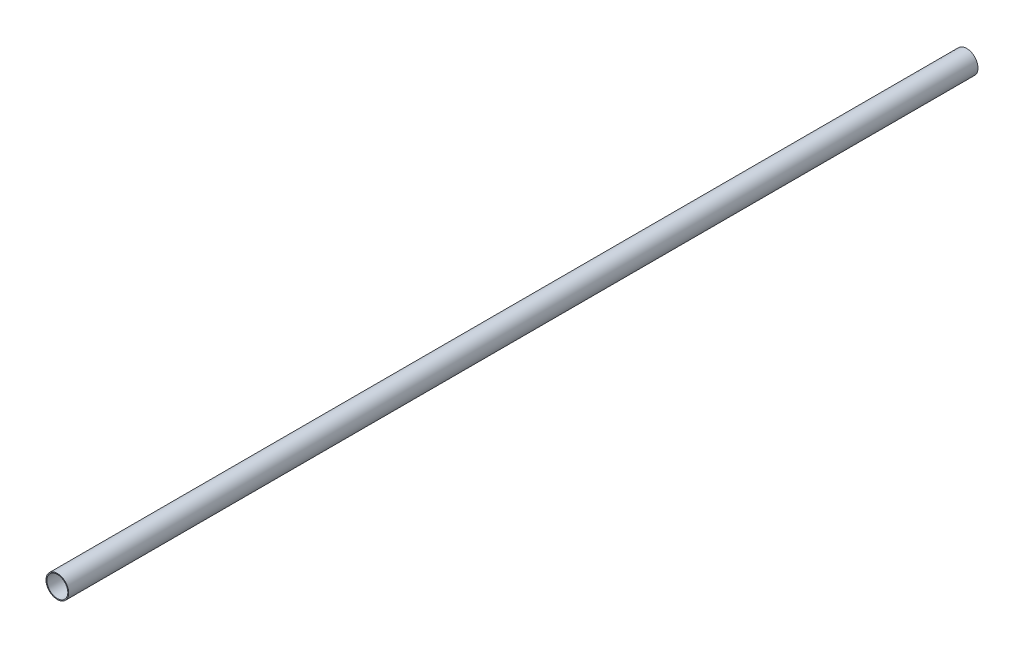
ISO-10303-21;
HEADER;
FILE_DESCRIPTION(('STEP AP214'),'2;1');
FILE_NAME('part.step','',(''),(''),'','','');
FILE_SCHEMA(('AUTOMOTIVE_DESIGN { 1 0 10303 214 1 1 1 1 }'));
ENDSEC;
DATA;
#1=APPLICATION_CONTEXT('core data for automotive mechanical design processes');
#2=APPLICATION_PROTOCOL_DEFINITION('international standard','automotive_design',2000,#1);
#3=PRODUCT_CONTEXT('',#1,'mechanical');
#4=PRODUCT('Part','Part','',(#3));
#5=PRODUCT_RELATED_PRODUCT_CATEGORY('part','',(#4));
#6=PRODUCT_DEFINITION_FORMATION('','',#4);
#7=PRODUCT_DEFINITION_CONTEXT('part definition',#1,'design');
#8=PRODUCT_DEFINITION('design','',#6,#7);
#9=PRODUCT_DEFINITION_SHAPE('','',#8);
#10=(LENGTH_UNIT() NAMED_UNIT(*) SI_UNIT(.MILLI.,.METRE.));
#11=(NAMED_UNIT(*) PLANE_ANGLE_UNIT() SI_UNIT($,.RADIAN.));
#12=(NAMED_UNIT(*) SI_UNIT($,.STERADIAN.) SOLID_ANGLE_UNIT());
#13=UNCERTAINTY_MEASURE_WITH_UNIT(LENGTH_MEASURE(1.E-05),#10,'distance_accuracy_value','');
#14=(GEOMETRIC_REPRESENTATION_CONTEXT(3) GLOBAL_UNCERTAINTY_ASSIGNED_CONTEXT((#13)) GLOBAL_UNIT_ASSIGNED_CONTEXT((#10,
#11,#12)) REPRESENTATION_CONTEXT('',''));
#15=CARTESIAN_POINT('',(0.,0.,0.));
#16=DIRECTION('',(0.,0.,1.));
#17=DIRECTION('',(1.,0.,0.));
#18=AXIS2_PLACEMENT_3D('',#15,#16,#17);
#19=CARTESIAN_POINT('',(0.,0.,1000.));
#20=DIRECTION('',(0.,0.,1.));
#21=DIRECTION('',(1.,0.,0.));
#22=AXIS2_PLACEMENT_3D('',#19,#20,#21);
#23=PLANE('',#22);
#24=CARTESIAN_POINT('',(0.,0.,1000.));
#25=DIRECTION('',(0.,0.,1.));
#26=DIRECTION('',(1.,0.,0.));
#27=AXIS2_PLACEMENT_3D('',#24,#25,#26);
#28=CIRCLE('',#27,12.5);
#29=CARTESIAN_POINT('',(12.5,0.,1000.));
#30=VERTEX_POINT('',#29);
#31=EDGE_CURVE('E10',#30,#30,#28,.T.);
#32=ORIENTED_EDGE('',*,*,#31,.T.);
#33=EDGE_LOOP('',(#32));
#34=FACE_BOUND('',#33,.T.);
#35=CARTESIAN_POINT('',(0.,0.,1000.));
#36=DIRECTION('',(0.,0.,1.));
#37=DIRECTION('',(1.,0.,0.));
#38=AXIS2_PLACEMENT_3D('',#35,#36,#37);
#39=CIRCLE('',#38,11.5);
#40=CARTESIAN_POINT('',(11.5,0.,1000.));
#41=VERTEX_POINT('',#40);
#42=EDGE_CURVE('E50',#41,#41,#39,.T.);
#43=ORIENTED_EDGE('',*,*,#42,.F.);
#44=EDGE_LOOP('',(#43));
#45=FACE_BOUND('',#44,.T.);
#46=ADVANCED_FACE('F37',(#34,#45),#23,.T.);
#47=CARTESIAN_POINT('',(0.,0.,0.));
#48=DIRECTION('',(0.,0.,1.));
#49=DIRECTION('',(1.,0.,0.));
#50=AXIS2_PLACEMENT_3D('',#47,#48,#49);
#51=PLANE('',#50);
#52=CARTESIAN_POINT('',(0.,0.,0.));
#53=DIRECTION('',(0.,0.,1.));
#54=DIRECTION('',(1.,0.,0.));
#55=AXIS2_PLACEMENT_3D('',#52,#53,#54);
#56=CIRCLE('',#55,12.5);
#57=CARTESIAN_POINT('',(12.5,0.,0.));
#58=VERTEX_POINT('',#57);
#59=EDGE_CURVE('E41',#58,#58,#56,.T.);
#60=ORIENTED_EDGE('',*,*,#59,.F.);
#61=EDGE_LOOP('',(#60));
#62=FACE_BOUND('',#61,.T.);
#63=CARTESIAN_POINT('',(0.,0.,0.));
#64=DIRECTION('',(0.,0.,1.));
#65=DIRECTION('',(1.,0.,0.));
#66=AXIS2_PLACEMENT_3D('',#63,#64,#65);
#67=CIRCLE('',#66,11.5);
#68=CARTESIAN_POINT('',(11.5,0.,0.));
#69=VERTEX_POINT('',#68);
#70=EDGE_CURVE('E52',#69,#69,#67,.T.);
#71=ORIENTED_EDGE('',*,*,#70,.T.);
#72=EDGE_LOOP('',(#71));
#73=FACE_BOUND('',#72,.T.);
#74=ADVANCED_FACE('F64',(#62,#73),#51,.F.);
#75=CARTESIAN_POINT('',(0.,0.,1000.));
#76=DIRECTION('',(0.,0.,-1.));
#77=DIRECTION('',(-1.,0.,0.));
#78=AXIS2_PLACEMENT_3D('',#75,#76,#77);
#79=CYLINDRICAL_SURFACE('',#78,12.5);
#80=ORIENTED_EDGE('',*,*,#31,.F.);
#81=EDGE_LOOP('',(#80));
#82=FACE_BOUND('',#81,.T.);
#83=ORIENTED_EDGE('',*,*,#59,.T.);
#84=EDGE_LOOP('',(#83));
#85=FACE_BOUND('',#84,.T.);
#86=ADVANCED_FACE('F39',(#82,#85),#79,.T.);
#87=CARTESIAN_POINT('',(0.,0.,1000.));
#88=DIRECTION('',(0.,0.,-1.));
#89=DIRECTION('',(-1.,0.,0.));
#90=AXIS2_PLACEMENT_3D('',#87,#88,#89);
#91=CYLINDRICAL_SURFACE('',#90,11.5);
#92=ORIENTED_EDGE('',*,*,#42,.T.);
#93=EDGE_LOOP('',(#92));
#94=FACE_BOUND('',#93,.T.);
#95=ORIENTED_EDGE('',*,*,#70,.F.);
#96=EDGE_LOOP('',(#95));
#97=FACE_BOUND('',#96,.T.);
#98=ADVANCED_FACE('F60',(#94,#97),#91,.F.);
#99=CLOSED_SHELL('',(#46,#74,#86,#98));
#100=MANIFOLD_SOLID_BREP('B2',#99);
#101=ADVANCED_BREP_SHAPE_REPRESENTATION('',(#18,#100),#14);
#102=SHAPE_DEFINITION_REPRESENTATION(#9,#101);
ENDSEC;
END-ISO-10303-21;
